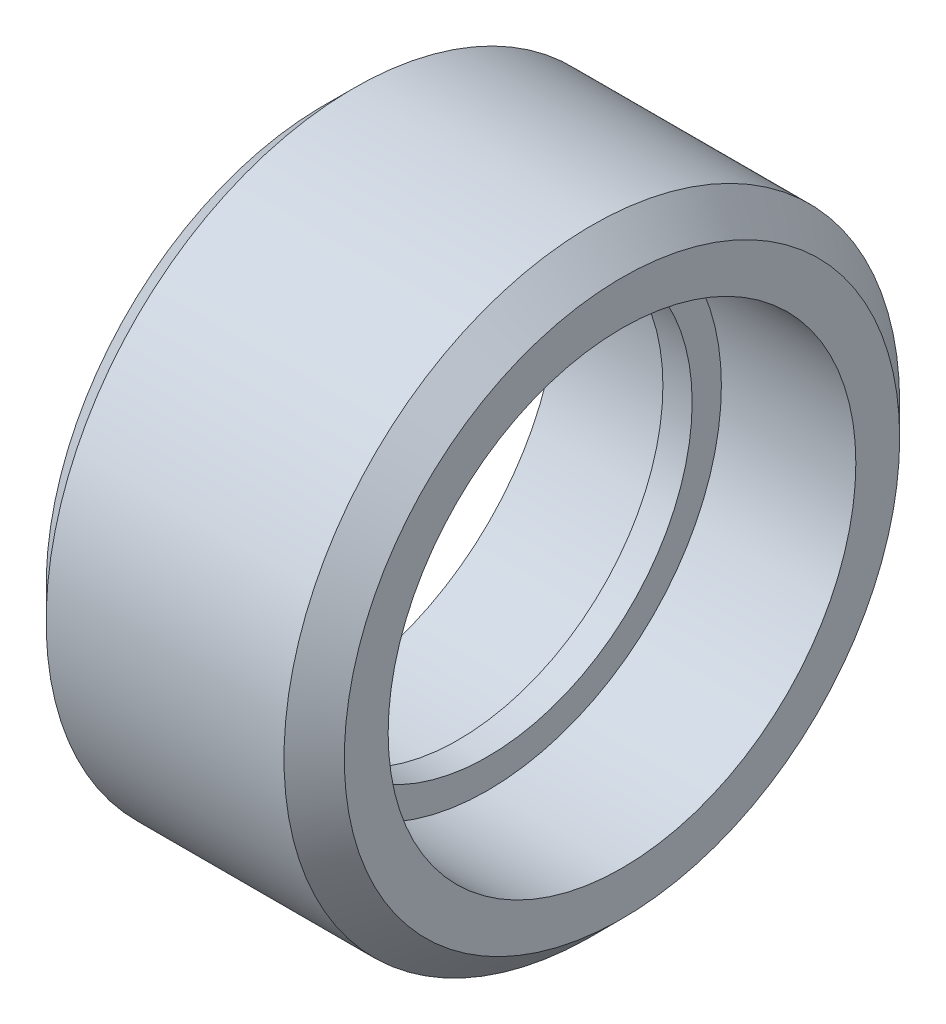
ISO-10303-21;
HEADER;
FILE_DESCRIPTION(('STEP AP214'),'2;1');
FILE_NAME('part.step','',(''),(''),'','','');
FILE_SCHEMA(('AUTOMOTIVE_DESIGN { 1 0 10303 214 1 1 1 1 }'));
ENDSEC;
DATA;
#1=APPLICATION_CONTEXT('core data for automotive mechanical design processes');
#2=APPLICATION_PROTOCOL_DEFINITION('international standard','automotive_design',2000,#1);
#3=PRODUCT_CONTEXT('',#1,'mechanical');
#4=PRODUCT('Part','Part','',(#3));
#5=PRODUCT_RELATED_PRODUCT_CATEGORY('part','',(#4));
#6=PRODUCT_DEFINITION_FORMATION('','',#4);
#7=PRODUCT_DEFINITION_CONTEXT('part definition',#1,'design');
#8=PRODUCT_DEFINITION('design','',#6,#7);
#9=PRODUCT_DEFINITION_SHAPE('','',#8);
#10=(LENGTH_UNIT() NAMED_UNIT(*) SI_UNIT(.MILLI.,.METRE.));
#11=(NAMED_UNIT(*) PLANE_ANGLE_UNIT() SI_UNIT($,.RADIAN.));
#12=(NAMED_UNIT(*) SI_UNIT($,.STERADIAN.) SOLID_ANGLE_UNIT());
#13=UNCERTAINTY_MEASURE_WITH_UNIT(LENGTH_MEASURE(1.E-05),#10,'distance_accuracy_value','');
#14=(GEOMETRIC_REPRESENTATION_CONTEXT(3) GLOBAL_UNCERTAINTY_ASSIGNED_CONTEXT((#13)) GLOBAL_UNIT_ASSIGNED_CONTEXT((#10,
#11,#12)) REPRESENTATION_CONTEXT('',''));
#15=CARTESIAN_POINT('',(0.,0.,0.));
#16=DIRECTION('',(0.,0.,1.));
#17=DIRECTION('',(1.,0.,0.));
#18=AXIS2_PLACEMENT_3D('',#15,#16,#17);
#19=CARTESIAN_POINT('',(0.,0.,0.));
#20=DIRECTION('',(1.,0.,0.));
#21=DIRECTION('',(0.,0.,-1.));
#22=AXIS2_PLACEMENT_3D('',#19,#20,#21);
#23=CYLINDRICAL_SURFACE('',#22,7.97673452430411);
#24=CARTESIAN_POINT('',(-0.569766751736008,0.,0.));
#25=DIRECTION('',(1.,0.,0.));
#26=DIRECTION('',(0.,0.,-1.));
#27=AXIS2_PLACEMENT_3D('',#24,#25,#26);
#28=CIRCLE('',#27,7.97673452430411);
#29=CARTESIAN_POINT('',(-0.569766751736008,0.,-7.97673452430411));
#30=VERTEX_POINT('',#29);
#31=EDGE_CURVE('E10',#30,#30,#28,.T.);
#32=ORIENTED_EDGE('',*,*,#31,.F.);
#33=EDGE_LOOP('',(#32));
#34=FACE_BOUND('',#33,.T.);
#35=CARTESIAN_POINT('',(0.569766751736008,0.,0.));
#36=DIRECTION('',(1.,0.,0.));
#37=DIRECTION('',(0.,0.,-1.));
#38=AXIS2_PLACEMENT_3D('',#35,#36,#37);
#39=CIRCLE('',#38,7.97673452430411);
#40=CARTESIAN_POINT('',(0.569766751736008,0.,-7.97673452430411));
#41=VERTEX_POINT('',#40);
#42=EDGE_CURVE('E55',#41,#41,#39,.T.);
#43=ORIENTED_EDGE('',*,*,#42,.T.);
#44=EDGE_LOOP('',(#43));
#45=FACE_BOUND('',#44,.T.);
#46=ADVANCED_FACE('F33',(#34,#45),#23,.F.);
#47=CARTESIAN_POINT('',(-0.569766751736008,7.97673452430411,0.));
#48=DIRECTION('',(-1.,0.,0.));
#49=DIRECTION('',(0.,0.,1.));
#50=AXIS2_PLACEMENT_3D('',#47,#48,#49);
#51=PLANE('',#50);
#52=ORIENTED_EDGE('',*,*,#31,.T.);
#53=EDGE_LOOP('',(#52));
#54=FACE_BOUND('',#53,.T.);
#55=CARTESIAN_POINT('',(-0.569766751736008,0.,0.));
#56=DIRECTION('',(1.,0.,0.));
#57=DIRECTION('',(0.,0.,-1.));
#58=AXIS2_PLACEMENT_3D('',#55,#56,#57);
#59=CIRCLE('',#58,9.11626802777613);
#60=CARTESIAN_POINT('',(-0.569766751736008,0.,-9.11626802777613));
#61=VERTEX_POINT('',#60);
#62=EDGE_CURVE('E39',#61,#61,#59,.T.);
#63=ORIENTED_EDGE('',*,*,#62,.F.);
#64=EDGE_LOOP('',(#63));
#65=FACE_BOUND('',#64,.T.);
#66=ADVANCED_FACE('F90',(#54,#65),#51,.T.);
#67=CARTESIAN_POINT('',(0.,0.,0.));
#68=DIRECTION('',(1.,0.,0.));
#69=DIRECTION('',(0.,0.,-1.));
#70=AXIS2_PLACEMENT_3D('',#67,#68,#69);
#71=CYLINDRICAL_SURFACE('',#70,9.11626802777613);
#72=ORIENTED_EDGE('',*,*,#62,.T.);
#73=EDGE_LOOP('',(#72));
#74=FACE_BOUND('',#73,.T.);
#75=CARTESIAN_POINT('',(-5.81162086770728,0.,0.));
#76=DIRECTION('',(1.,0.,0.));
#77=DIRECTION('',(0.,0.,-1.));
#78=AXIS2_PLACEMENT_3D('',#75,#76,#77);
#79=CIRCLE('',#78,9.11626802777613);
#80=CARTESIAN_POINT('',(-5.81162086770728,0.,-9.11626802777613));
#81=VERTEX_POINT('',#80);
#82=EDGE_CURVE('E43',#81,#81,#79,.T.);
#83=ORIENTED_EDGE('',*,*,#82,.F.);
#84=EDGE_LOOP('',(#83));
#85=FACE_BOUND('',#84,.T.);
#86=ADVANCED_FACE('F95',(#74,#85),#71,.F.);
#87=CARTESIAN_POINT('',(-5.81162086770728,9.11626802777613,0.));
#88=DIRECTION('',(-1.,0.,0.));
#89=DIRECTION('',(0.,0.,1.));
#90=AXIS2_PLACEMENT_3D('',#87,#88,#89);
#91=PLANE('',#90);
#92=ORIENTED_EDGE('',*,*,#82,.T.);
#93=EDGE_LOOP('',(#92));
#94=FACE_BOUND('',#93,.T.);
#95=CARTESIAN_POINT('',(-5.81162086770728,0.,0.));
#96=DIRECTION('',(1.,0.,0.));
#97=DIRECTION('',(0.,0.,-1.));
#98=AXIS2_PLACEMENT_3D('',#95,#96,#97);
#99=CIRCLE('',#98,10.8255682829842);
#100=CARTESIAN_POINT('',(-5.81162086770728,0.,-10.8255682829842));
#101=VERTEX_POINT('',#100);
#102=EDGE_CURVE('E47',#101,#101,#99,.T.);
#103=ORIENTED_EDGE('',*,*,#102,.F.);
#104=EDGE_LOOP('',(#103));
#105=FACE_BOUND('',#104,.T.);
#106=ADVANCED_FACE('F86',(#94,#105),#91,.T.);
#107=CARTESIAN_POINT('',(-4.63633969419843,0.,0.));
#108=DIRECTION('',(1.,0.,0.));
#109=DIRECTION('',(0.,0.,-1.));
#110=AXIS2_PLACEMENT_3D('',#107,#108,#109);
#111=CONICAL_SURFACE('',#110,12.000849456493,0.78539816339745);
#112=ORIENTED_EDGE('',*,*,#102,.T.);
#113=EDGE_LOOP('',(#112));
#114=FACE_BOUND('',#113,.T.);
#115=CARTESIAN_POINT('',(-4.63633969419843,0.,0.));
#116=DIRECTION('',(1.,0.,0.));
#117=DIRECTION('',(0.,0.,-1.));
#118=AXIS2_PLACEMENT_3D('',#115,#116,#117);
#119=CIRCLE('',#118,12.000849456493);
#120=CARTESIAN_POINT('',(-4.63633969419843,0.,-12.000849456493));
#121=VERTEX_POINT('',#120);
#122=EDGE_CURVE('E52',#121,#121,#119,.T.);
#123=ORIENTED_EDGE('',*,*,#122,.F.);
#124=EDGE_LOOP('',(#123));
#125=FACE_BOUND('',#124,.T.);
#126=ADVANCED_FACE('F76',(#114,#125),#111,.T.);
#127=CARTESIAN_POINT('',(0.,0.,0.));
#128=DIRECTION('',(1.,0.,0.));
#129=DIRECTION('',(0.,0.,-1.));
#130=AXIS2_PLACEMENT_3D('',#127,#128,#129);
#131=CYLINDRICAL_SURFACE('',#130,12.000849456493);
#132=ORIENTED_EDGE('',*,*,#122,.T.);
#133=EDGE_LOOP('',(#132));
#134=FACE_BOUND('',#133,.T.);
#135=CARTESIAN_POINT('',(4.63633969419843,0.,0.));
#136=DIRECTION('',(1.,0.,0.));
#137=DIRECTION('',(0.,0.,-1.));
#138=AXIS2_PLACEMENT_3D('',#135,#136,#137);
#139=CIRCLE('',#138,12.000849456493);
#140=CARTESIAN_POINT('',(4.63633969419843,0.,-12.000849456493));
#141=VERTEX_POINT('',#140);
#142=EDGE_CURVE('E67',#141,#141,#139,.T.);
#143=ORIENTED_EDGE('',*,*,#142,.F.);
#144=EDGE_LOOP('',(#143));
#145=FACE_BOUND('',#144,.T.);
#146=ADVANCED_FACE('F73',(#134,#145),#131,.T.);
#147=CARTESIAN_POINT('',(0.569766751736008,7.97673452430411,0.));
#148=DIRECTION('',(1.,0.,0.));
#149=DIRECTION('',(0.,0.,1.));
#150=AXIS2_PLACEMENT_3D('',#147,#148,#149);
#151=PLANE('',#150);
#152=ORIENTED_EDGE('',*,*,#42,.F.);
#153=EDGE_LOOP('',(#152));
#154=FACE_BOUND('',#153,.T.);
#155=CARTESIAN_POINT('',(0.569766751736008,0.,0.));
#156=DIRECTION('',(1.,0.,0.));
#157=DIRECTION('',(0.,0.,-1.));
#158=AXIS2_PLACEMENT_3D('',#155,#156,#157);
#159=CIRCLE('',#158,9.11626802777613);
#160=CARTESIAN_POINT('',(0.569766751736008,0.,-9.11626802777613));
#161=VERTEX_POINT('',#160);
#162=EDGE_CURVE('E58',#161,#161,#159,.T.);
#163=ORIENTED_EDGE('',*,*,#162,.T.);
#164=EDGE_LOOP('',(#163));
#165=FACE_BOUND('',#164,.T.);
#166=ADVANCED_FACE('F75',(#154,#165),#151,.T.);
#167=CARTESIAN_POINT('',(0.,0.,0.));
#168=DIRECTION('',(-1.,0.,0.));
#169=DIRECTION('',(0.,0.,-1.));
#170=AXIS2_PLACEMENT_3D('',#167,#168,#169);
#171=CYLINDRICAL_SURFACE('',#170,9.11626802777613);
#172=ORIENTED_EDGE('',*,*,#162,.F.);
#173=EDGE_LOOP('',(#172));
#174=FACE_BOUND('',#173,.T.);
#175=CARTESIAN_POINT('',(5.81162086770728,0.,0.));
#176=DIRECTION('',(1.,0.,0.));
#177=DIRECTION('',(0.,0.,-1.));
#178=AXIS2_PLACEMENT_3D('',#175,#176,#177);
#179=CIRCLE('',#178,9.11626802777613);
#180=CARTESIAN_POINT('',(5.81162086770728,0.,-9.11626802777613));
#181=VERTEX_POINT('',#180);
#182=EDGE_CURVE('E61',#181,#181,#179,.T.);
#183=ORIENTED_EDGE('',*,*,#182,.T.);
#184=EDGE_LOOP('',(#183));
#185=FACE_BOUND('',#184,.T.);
#186=ADVANCED_FACE('F83',(#174,#185),#171,.F.);
#187=CARTESIAN_POINT('',(5.81162086770728,9.11626802777613,0.));
#188=DIRECTION('',(1.,0.,0.));
#189=DIRECTION('',(0.,0.,1.));
#190=AXIS2_PLACEMENT_3D('',#187,#188,#189);
#191=PLANE('',#190);
#192=ORIENTED_EDGE('',*,*,#182,.F.);
#193=EDGE_LOOP('',(#192));
#194=FACE_BOUND('',#193,.T.);
#195=CARTESIAN_POINT('',(5.81162086770728,0.,0.));
#196=DIRECTION('',(1.,0.,0.));
#197=DIRECTION('',(0.,0.,-1.));
#198=AXIS2_PLACEMENT_3D('',#195,#196,#197);
#199=CIRCLE('',#198,10.8255682829842);
#200=CARTESIAN_POINT('',(5.81162086770728,0.,-10.8255682829842));
#201=VERTEX_POINT('',#200);
#202=EDGE_CURVE('E64',#201,#201,#199,.T.);
#203=ORIENTED_EDGE('',*,*,#202,.T.);
#204=EDGE_LOOP('',(#203));
#205=FACE_BOUND('',#204,.T.);
#206=ADVANCED_FACE('F103',(#194,#205),#191,.T.);
#207=CARTESIAN_POINT('',(4.63633969419843,0.,0.));
#208=DIRECTION('',(-1.,0.,0.));
#209=DIRECTION('',(0.,0.,-1.));
#210=AXIS2_PLACEMENT_3D('',#207,#208,#209);
#211=CONICAL_SURFACE('',#210,12.000849456493,0.78539816339745);
#212=ORIENTED_EDGE('',*,*,#202,.F.);
#213=EDGE_LOOP('',(#212));
#214=FACE_BOUND('',#213,.T.);
#215=ORIENTED_EDGE('',*,*,#142,.T.);
#216=EDGE_LOOP('',(#215));
#217=FACE_BOUND('',#216,.T.);
#218=ADVANCED_FACE('F71',(#214,#217),#211,.T.);
#219=CLOSED_SHELL('',(#46,#66,#86,#106,#126,#146,#166,#186,#206,#218));
#220=MANIFOLD_SOLID_BREP('B2',#219);
#221=ADVANCED_BREP_SHAPE_REPRESENTATION('',(#18,#220),#14);
#222=SHAPE_DEFINITION_REPRESENTATION(#9,#221);
ENDSEC;
END-ISO-10303-21;
